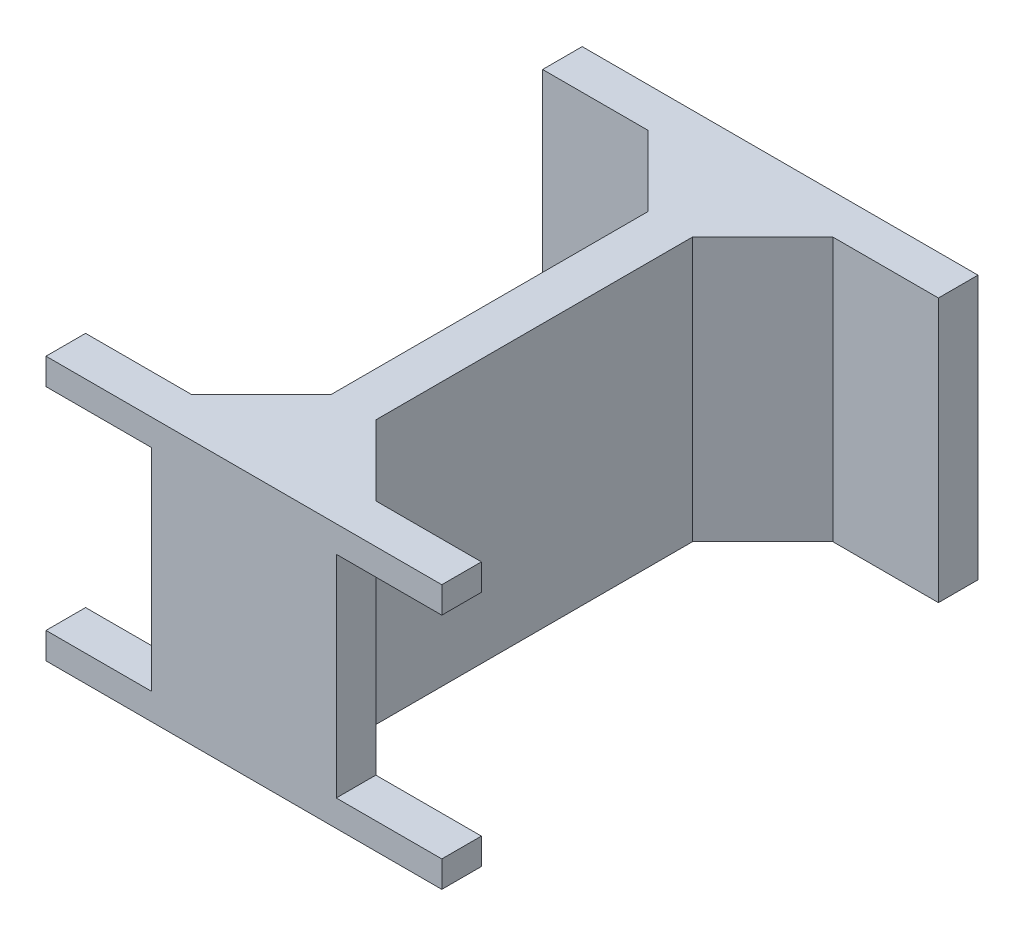
ISO-10303-21;
HEADER;
FILE_DESCRIPTION(('STEP AP214'),'2;1');
FILE_NAME('part.step','',(''),(''),'','','');
FILE_SCHEMA(('AUTOMOTIVE_DESIGN { 1 0 10303 214 1 1 1 1 }'));
ENDSEC;
DATA;
#1=APPLICATION_CONTEXT('core data for automotive mechanical design processes');
#2=APPLICATION_PROTOCOL_DEFINITION('international standard','automotive_design',2000,#1);
#3=PRODUCT_CONTEXT('',#1,'mechanical');
#4=PRODUCT('Part','Part','',(#3));
#5=PRODUCT_RELATED_PRODUCT_CATEGORY('part','',(#4));
#6=PRODUCT_DEFINITION_FORMATION('','',#4);
#7=PRODUCT_DEFINITION_CONTEXT('part definition',#1,'design');
#8=PRODUCT_DEFINITION('design','',#6,#7);
#9=PRODUCT_DEFINITION_SHAPE('','',#8);
#10=(LENGTH_UNIT() NAMED_UNIT(*) SI_UNIT(.MILLI.,.METRE.));
#11=(NAMED_UNIT(*) PLANE_ANGLE_UNIT() SI_UNIT($,.RADIAN.));
#12=(NAMED_UNIT(*) SI_UNIT($,.STERADIAN.) SOLID_ANGLE_UNIT());
#13=UNCERTAINTY_MEASURE_WITH_UNIT(LENGTH_MEASURE(1.E-05),#10,'distance_accuracy_value','');
#14=(GEOMETRIC_REPRESENTATION_CONTEXT(3) GLOBAL_UNCERTAINTY_ASSIGNED_CONTEXT((#13)) GLOBAL_UNIT_ASSIGNED_CONTEXT((#10,
#11,#12)) REPRESENTATION_CONTEXT('',''));
#15=CARTESIAN_POINT('',(0.,0.,0.));
#16=DIRECTION('',(0.,0.,1.));
#17=DIRECTION('',(1.,0.,0.));
#18=AXIS2_PLACEMENT_3D('',#15,#16,#17);
#19=CARTESIAN_POINT('',(-40.8076923076923,18.1864697802198,101.6));
#20=DIRECTION('',(1.,0.,0.));
#21=DIRECTION('',(0.,1.,0.));
#22=AXIS2_PLACEMENT_3D('',#19,#20,#21);
#23=PLANE('',#22);
#24=DIRECTION('',(0.,1.,0.));
#25=VECTOR('',#24,1.);
#26=CARTESIAN_POINT('',(-40.8076923076923,-83.4135302197802,94.1));
#27=LINE('',#26,#25);
#28=CARTESIAN_POINT('',(-40.8076923076923,13.1864697802198,94.1));
#29=VERTEX_POINT('',#28);
#30=CARTESIAN_POINT('',(-40.8076923076923,18.1864697802198,94.1));
#31=VERTEX_POINT('',#30);
#32=EDGE_CURVE('E284',#29,#31,#27,.T.);
#33=ORIENTED_EDGE('',*,*,#32,.F.);
#34=DIRECTION('',(0.,0.,1.));
#35=VECTOR('',#34,1.);
#36=CARTESIAN_POINT('',(-40.8076923076923,13.1864697802198,91.6));
#37=LINE('',#36,#35);
#38=CARTESIAN_POINT('',(-40.8076923076923,13.1864697802198,101.6));
#39=VERTEX_POINT('',#38);
#40=EDGE_CURVE('E630',#29,#39,#37,.T.);
#41=ORIENTED_EDGE('',*,*,#40,.T.);
#42=DIRECTION('',(0.,-1.,0.));
#43=VECTOR('',#42,1.);
#44=CARTESIAN_POINT('',(-40.8076923076923,18.1864697802198,101.6));
#45=LINE('',#44,#43);
#46=CARTESIAN_POINT('',(-40.8076923076923,18.1864697802198,101.6));
#47=VERTEX_POINT('',#46);
#48=EDGE_CURVE('E215',#47,#39,#45,.T.);
#49=ORIENTED_EDGE('',*,*,#48,.F.);
#50=DIRECTION('',(0.,0.,-1.));
#51=VECTOR('',#50,1.);
#52=CARTESIAN_POINT('',(-40.8076923076923,18.1864697802198,101.6));
#53=LINE('',#52,#51);
#54=EDGE_CURVE('E243',#47,#31,#53,.T.);
#55=ORIENTED_EDGE('',*,*,#54,.T.);
#56=EDGE_LOOP('',(#33,#41,#49,#55));
#57=FACE_BOUND('',#56,.T.);
#58=ADVANCED_FACE('F33',(#57),#23,.F.);
#59=CARTESIAN_POINT('',(-20.8076923076923,-83.4135302197802,94.1));
#60=DIRECTION('',(0.,0.,1.));
#61=DIRECTION('',(1.,0.,0.));
#62=AXIS2_PLACEMENT_3D('',#59,#60,#61);
#63=PLANE('',#62);
#64=DIRECTION('',(0.,1.,0.));
#65=VECTOR('',#64,1.);
#66=CARTESIAN_POINT('',(-20.8076923076923,-83.4135302197802,94.1));
#67=LINE('',#66,#65);
#68=CARTESIAN_POINT('',(-20.8076923076923,13.1864697802198,94.1));
#69=VERTEX_POINT('',#68);
#70=CARTESIAN_POINT('',(-20.8076923076923,18.1864697802198,94.1));
#71=VERTEX_POINT('',#70);
#72=EDGE_CURVE('E277',#69,#71,#67,.T.);
#73=ORIENTED_EDGE('',*,*,#72,.F.);
#74=DIRECTION('',(-1.,0.,0.));
#75=VECTOR('',#74,1.);
#76=CARTESIAN_POINT('',(-20.8076923076923,13.1864697802198,94.1));
#77=LINE('',#76,#75);
#78=EDGE_CURVE('E11',#69,#29,#77,.T.);
#79=ORIENTED_EDGE('',*,*,#78,.T.);
#80=ORIENTED_EDGE('',*,*,#32,.T.);
#81=DIRECTION('',(1.,0.,0.));
#82=VECTOR('',#81,1.);
#83=CARTESIAN_POINT('',(-20.8076923076923,18.1864697802198,94.1));
#84=LINE('',#83,#82);
#85=EDGE_CURVE('E346',#31,#71,#84,.T.);
#86=ORIENTED_EDGE('',*,*,#85,.T.);
#87=EDGE_LOOP('',(#73,#79,#80,#86));
#88=FACE_BOUND('',#87,.T.);
#89=ADVANCED_FACE('F382',(#88),#63,.F.);
#90=CARTESIAN_POINT('',(34.1923076923077,18.1864697802198,101.6));
#91=DIRECTION('',(-1.,0.,0.));
#92=DIRECTION('',(0.,-1.,0.));
#93=AXIS2_PLACEMENT_3D('',#90,#91,#92);
#94=PLANE('',#93);
#95=DIRECTION('',(0.,1.,0.));
#96=VECTOR('',#95,1.);
#97=CARTESIAN_POINT('',(34.1923076923077,-83.4135302197802,94.1));
#98=LINE('',#97,#96);
#99=CARTESIAN_POINT('',(34.1923076923077,-31.8135302197802,94.1));
#100=VERTEX_POINT('',#99);
#101=CARTESIAN_POINT('',(34.1923076923077,-26.8135302197802,94.1));
#102=VERTEX_POINT('',#101);
#103=EDGE_CURVE('E336',#100,#102,#98,.T.);
#104=ORIENTED_EDGE('',*,*,#103,.T.);
#105=DIRECTION('',(0.,0.,1.));
#106=VECTOR('',#105,1.);
#107=CARTESIAN_POINT('',(34.1923076923077,-26.8135302197802,91.6));
#108=LINE('',#107,#106);
#109=CARTESIAN_POINT('',(34.1923076923077,-26.8135302197802,101.6));
#110=VERTEX_POINT('',#109);
#111=EDGE_CURVE('E640',#102,#110,#108,.T.);
#112=ORIENTED_EDGE('',*,*,#111,.T.);
#113=DIRECTION('',(0.,1.,0.));
#114=VECTOR('',#113,1.);
#115=CARTESIAN_POINT('',(34.1923076923077,18.1864697802198,101.6));
#116=LINE('',#115,#114);
#117=CARTESIAN_POINT('',(34.1923076923077,-31.8135302197802,101.6));
#118=VERTEX_POINT('',#117);
#119=EDGE_CURVE('E229',#118,#110,#116,.T.);
#120=ORIENTED_EDGE('',*,*,#119,.F.);
#121=DIRECTION('',(0.,0.,-1.));
#122=VECTOR('',#121,1.);
#123=CARTESIAN_POINT('',(34.1923076923077,-31.8135302197802,101.6));
#124=LINE('',#123,#122);
#125=EDGE_CURVE('E251',#118,#100,#124,.T.);
#126=ORIENTED_EDGE('',*,*,#125,.T.);
#127=EDGE_LOOP('',(#104,#112,#120,#126));
#128=FACE_BOUND('',#127,.T.);
#129=ADVANCED_FACE('F387',(#128),#94,.F.);
#130=CARTESIAN_POINT('',(34.1923076923077,-83.4135302197802,94.1));
#131=DIRECTION('',(0.,0.,1.));
#132=DIRECTION('',(1.,0.,0.));
#133=AXIS2_PLACEMENT_3D('',#130,#131,#132);
#134=PLANE('',#133);
#135=DIRECTION('',(0.,1.,0.));
#136=VECTOR('',#135,1.);
#137=CARTESIAN_POINT('',(14.1923076923077,-83.4135302197802,94.1));
#138=LINE('',#137,#136);
#139=CARTESIAN_POINT('',(14.1923076923077,-31.8135302197802,94.1));
#140=VERTEX_POINT('',#139);
#141=CARTESIAN_POINT('',(14.1923076923077,-26.8135302197802,94.1));
#142=VERTEX_POINT('',#141);
#143=EDGE_CURVE('E660',#140,#142,#138,.T.);
#144=ORIENTED_EDGE('',*,*,#143,.T.);
#145=DIRECTION('',(1.,0.,0.));
#146=VECTOR('',#145,1.);
#147=CARTESIAN_POINT('',(34.1923076923077,-26.8135302197802,94.1));
#148=LINE('',#147,#146);
#149=EDGE_CURVE('E259',#142,#102,#148,.T.);
#150=ORIENTED_EDGE('',*,*,#149,.T.);
#151=ORIENTED_EDGE('',*,*,#103,.F.);
#152=DIRECTION('',(1.,0.,0.));
#153=VECTOR('',#152,1.);
#154=CARTESIAN_POINT('',(-40.8076923076923,-31.8135302197802,94.1000000000001));
#155=LINE('',#154,#153);
#156=EDGE_CURVE('E343',#140,#100,#155,.T.);
#157=ORIENTED_EDGE('',*,*,#156,.F.);
#158=EDGE_LOOP('',(#144,#150,#151,#157));
#159=FACE_BOUND('',#158,.T.);
#160=ADVANCED_FACE('F434',(#159),#134,.F.);
#161=CARTESIAN_POINT('',(34.1923076923077,13.1864697802198,101.6));
#162=VERTEX_POINT('',#161);
#163=CARTESIAN_POINT('',(34.1923076923077,18.1864697802198,101.6));
#164=VERTEX_POINT('',#163);
#165=EDGE_CURVE('E228',#162,#164,#116,.T.);
#166=ORIENTED_EDGE('',*,*,#165,.F.);
#167=DIRECTION('',(0.,0.,1.));
#168=VECTOR('',#167,1.);
#169=CARTESIAN_POINT('',(34.1923076923077,13.1864697802198,91.6));
#170=LINE('',#169,#168);
#171=CARTESIAN_POINT('',(34.1923076923077,13.1864697802198,94.1));
#172=VERTEX_POINT('',#171);
#173=EDGE_CURVE('E619',#172,#162,#170,.T.);
#174=ORIENTED_EDGE('',*,*,#173,.F.);
#175=CARTESIAN_POINT('',(34.1923076923077,18.1864697802198,94.1));
#176=VERTEX_POINT('',#175);
#177=EDGE_CURVE('E659',#172,#176,#98,.T.);
#178=ORIENTED_EDGE('',*,*,#177,.T.);
#179=DIRECTION('',(0.,0.,-1.));
#180=VECTOR('',#179,1.);
#181=CARTESIAN_POINT('',(34.1923076923077,18.1864697802198,101.6));
#182=LINE('',#181,#180);
#183=EDGE_CURVE('E247',#164,#176,#182,.T.);
#184=ORIENTED_EDGE('',*,*,#183,.F.);
#185=EDGE_LOOP('',(#166,#174,#178,#184));
#186=FACE_BOUND('',#185,.T.);
#187=ADVANCED_FACE('F392',(#186),#94,.F.);
#188=DIRECTION('',(0.,0.,-1.));
#189=VECTOR('',#188,1.);
#190=CARTESIAN_POINT('',(-40.8076923076923,-31.8135302197802,101.6));
#191=LINE('',#190,#189);
#192=CARTESIAN_POINT('',(-40.8076923076923,-31.8135302197802,7.50000000000001));
#193=VERTEX_POINT('',#192);
#194=CARTESIAN_POINT('',(-40.8076923076923,-31.8135302197802,0.));
#195=VERTEX_POINT('',#194);
#196=EDGE_CURVE('E254',#193,#195,#191,.T.);
#197=ORIENTED_EDGE('',*,*,#196,.F.);
#198=DIRECTION('',(0.,1.,0.));
#199=VECTOR('',#198,1.);
#200=CARTESIAN_POINT('',(-40.8076923076923,-83.4135302197802,7.50000000000001));
#201=LINE('',#200,#199);
#202=CARTESIAN_POINT('',(-40.8076923076923,18.1864697802198,7.50000000000001));
#203=VERTEX_POINT('',#202);
#204=EDGE_CURVE('E289',#193,#203,#201,.T.);
#205=ORIENTED_EDGE('',*,*,#204,.T.);
#206=CARTESIAN_POINT('',(-40.8076923076923,18.1864697802198,0.));
#207=VERTEX_POINT('',#206);
#208=EDGE_CURVE('E234',#203,#207,#53,.T.);
#209=ORIENTED_EDGE('',*,*,#208,.T.);
#210=DIRECTION('',(0.,-1.,0.));
#211=VECTOR('',#210,1.);
#212=CARTESIAN_POINT('',(-40.8076923076923,18.1864697802198,0.));
#213=LINE('',#212,#211);
#214=EDGE_CURVE('E235',#207,#195,#213,.T.);
#215=ORIENTED_EDGE('',*,*,#214,.T.);
#216=EDGE_LOOP('',(#197,#205,#209,#215));
#217=FACE_BOUND('',#216,.T.);
#218=ADVANCED_FACE('F305',(#217),#23,.F.);
#219=CARTESIAN_POINT('',(-40.8076923076923,-26.8135302197802,101.6));
#220=VERTEX_POINT('',#219);
#221=CARTESIAN_POINT('',(-40.8076923076923,-31.8135302197802,101.6));
#222=VERTEX_POINT('',#221);
#223=EDGE_CURVE('E207',#220,#222,#45,.T.);
#224=ORIENTED_EDGE('',*,*,#223,.F.);
#225=DIRECTION('',(0.,0.,1.));
#226=VECTOR('',#225,1.);
#227=CARTESIAN_POINT('',(-40.8076923076923,-26.8135302197802,91.6));
#228=LINE('',#227,#226);
#229=CARTESIAN_POINT('',(-40.8076923076923,-26.8135302197802,94.1));
#230=VERTEX_POINT('',#229);
#231=EDGE_CURVE('E192',#230,#220,#228,.T.);
#232=ORIENTED_EDGE('',*,*,#231,.F.);
#233=CARTESIAN_POINT('',(-40.8076923076923,-31.8135302197802,94.1));
#234=VERTEX_POINT('',#233);
#235=EDGE_CURVE('E267',#234,#230,#27,.T.);
#236=ORIENTED_EDGE('',*,*,#235,.F.);
#237=EDGE_CURVE('E214',#222,#234,#191,.T.);
#238=ORIENTED_EDGE('',*,*,#237,.F.);
#239=EDGE_LOOP('',(#224,#232,#236,#238));
#240=FACE_BOUND('',#239,.T.);
#241=ADVANCED_FACE('F35',(#240),#23,.F.);
#242=CARTESIAN_POINT('',(-40.8076923076923,-31.8135302197802,101.6));
#243=DIRECTION('',(0.,1.,0.));
#244=DIRECTION('',(0.,0.,1.));
#245=AXIS2_PLACEMENT_3D('',#242,#243,#244);
#246=PLANE('',#245);
#247=DIRECTION('',(0.707106781186547,0.,0.707106781186549));
#248=VECTOR('',#247,1.);
#249=CARTESIAN_POINT('',(-9.55769230769222,-31.8135302197802,70.35));
#250=LINE('',#249,#248);
#251=CARTESIAN_POINT('',(0.892307692307742,-31.8135302197802,80.8));
#252=VERTEX_POINT('',#251);
#253=EDGE_CURVE('E341',#252,#140,#250,.T.);
#254=ORIENTED_EDGE('',*,*,#253,.T.);
#255=ORIENTED_EDGE('',*,*,#156,.T.);
#256=ORIENTED_EDGE('',*,*,#125,.F.);
#257=DIRECTION('',(1.,0.,0.));
#258=VECTOR('',#257,1.);
#259=CARTESIAN_POINT('',(-40.8076923076923,-31.8135302197802,101.6));
#260=LINE('',#259,#258);
#261=EDGE_CURVE('E219',#222,#118,#260,.T.);
#262=ORIENTED_EDGE('',*,*,#261,.F.);
#263=ORIENTED_EDGE('',*,*,#237,.T.);
#264=DIRECTION('',(1.,0.,0.));
#265=VECTOR('',#264,1.);
#266=CARTESIAN_POINT('',(-40.8076923076923,-31.8135302197802,94.1));
#267=LINE('',#266,#265);
#268=CARTESIAN_POINT('',(-20.8076923076923,-31.8135302197802,94.1));
#269=VERTEX_POINT('',#268);
#270=EDGE_CURVE('E287',#234,#269,#267,.T.);
#271=ORIENTED_EDGE('',*,*,#270,.T.);
#272=DIRECTION('',(0.707106781186545,0.,-0.70710678118655));
#273=VECTOR('',#272,1.);
#274=CARTESIAN_POINT('',(-34.5576923076922,-31.8135302197802,107.85));
#275=LINE('',#274,#273);
#276=CARTESIAN_POINT('',(-7.50769230769244,-31.8135302197802,80.8));
#277=VERTEX_POINT('',#276);
#278=EDGE_CURVE('E274',#269,#277,#275,.T.);
#279=ORIENTED_EDGE('',*,*,#278,.T.);
#280=DIRECTION('',(0.,0.,-1.));
#281=VECTOR('',#280,1.);
#282=CARTESIAN_POINT('',(-7.50769230769244,-31.8135302197802,101.6));
#283=LINE('',#282,#281);
#284=CARTESIAN_POINT('',(-7.50769230769245,-31.8135302197802,20.8));
#285=VERTEX_POINT('',#284);
#286=EDGE_CURVE('E291',#277,#285,#283,.T.);
#287=ORIENTED_EDGE('',*,*,#286,.T.);
#288=DIRECTION('',(-0.707106781186542,0.,-0.707106781186553));
#289=VECTOR('',#288,1.);
#290=CARTESIAN_POINT('',(16.2423076923078,-31.8135302197802,44.5500000000007));
#291=LINE('',#290,#289);
#292=CARTESIAN_POINT('',(-20.8076923076923,-31.8135302197802,7.5));
#293=VERTEX_POINT('',#292);
#294=EDGE_CURVE('E293',#285,#293,#291,.T.);
#295=ORIENTED_EDGE('',*,*,#294,.T.);
#296=DIRECTION('',(-1.,0.,0.));
#297=VECTOR('',#296,1.);
#298=CARTESIAN_POINT('',(-40.8076923076923,-31.8135302197802,7.50000000000001));
#299=LINE('',#298,#297);
#300=EDGE_CURVE('E225',#293,#193,#299,.T.);
#301=ORIENTED_EDGE('',*,*,#300,.T.);
#302=ORIENTED_EDGE('',*,*,#196,.T.);
#303=DIRECTION('',(1.,0.,0.));
#304=VECTOR('',#303,1.);
#305=CARTESIAN_POINT('',(-40.8076923076923,-31.8135302197802,0.));
#306=LINE('',#305,#304);
#307=CARTESIAN_POINT('',(34.1923076923077,-31.8135302197802,0.));
#308=VERTEX_POINT('',#307);
#309=EDGE_CURVE('E238',#195,#308,#306,.T.);
#310=ORIENTED_EDGE('',*,*,#309,.T.);
#311=CARTESIAN_POINT('',(34.1923076923077,-31.8135302197802,7.50000000000001));
#312=VERTEX_POINT('',#311);
#313=EDGE_CURVE('E250',#312,#308,#124,.T.);
#314=ORIENTED_EDGE('',*,*,#313,.F.);
#315=DIRECTION('',(-1.,0.,0.));
#316=VECTOR('',#315,1.);
#317=CARTESIAN_POINT('',(-40.8076923076923,-31.8135302197802,7.49999999999999));
#318=LINE('',#317,#316);
#319=CARTESIAN_POINT('',(14.1923076923077,-31.8135302197802,7.5));
#320=VERTEX_POINT('',#319);
#321=EDGE_CURVE('E315',#312,#320,#318,.T.);
#322=ORIENTED_EDGE('',*,*,#321,.T.);
#323=DIRECTION('',(-0.707106781186546,0.,0.707106781186549));
#324=VECTOR('',#323,1.);
#325=CARTESIAN_POINT('',(-60.3576923076922,-31.8135302197802,82.0500000000002));
#326=LINE('',#325,#324);
#327=CARTESIAN_POINT('',(0.892307692307742,-31.8135302197802,20.8));
#328=VERTEX_POINT('',#327);
#329=EDGE_CURVE('E335',#320,#328,#326,.T.);
#330=ORIENTED_EDGE('',*,*,#329,.T.);
#331=DIRECTION('',(0.,0.,1.));
#332=VECTOR('',#331,1.);
#333=CARTESIAN_POINT('',(0.892307692307741,-31.8135302197802,101.6));
#334=LINE('',#333,#332);
#335=EDGE_CURVE('E338',#328,#252,#334,.T.);
#336=ORIENTED_EDGE('',*,*,#335,.T.);
#337=EDGE_LOOP('',(#254,#255,#256,#262,#263,#271,#279,#287,#295,#301,#302,#310,#314,#322,#330,#336));
#338=FACE_BOUND('',#337,.T.);
#339=ADVANCED_FACE('F299',(#338),#246,.F.);
#340=CARTESIAN_POINT('',(34.1923076923077,18.1864697802198,7.50000000000001));
#341=VERTEX_POINT('',#340);
#342=CARTESIAN_POINT('',(34.1923076923077,18.1864697802198,0.));
#343=VERTEX_POINT('',#342);
#344=EDGE_CURVE('E246',#341,#343,#182,.T.);
#345=ORIENTED_EDGE('',*,*,#344,.F.);
#346=DIRECTION('',(0.,1.,0.));
#347=VECTOR('',#346,1.);
#348=CARTESIAN_POINT('',(34.1923076923077,-83.4135302197802,7.50000000000001));
#349=LINE('',#348,#347);
#350=EDGE_CURVE('E320',#312,#341,#349,.T.);
#351=ORIENTED_EDGE('',*,*,#350,.F.);
#352=ORIENTED_EDGE('',*,*,#313,.T.);
#353=DIRECTION('',(0.,1.,0.));
#354=VECTOR('',#353,1.);
#355=CARTESIAN_POINT('',(34.1923076923077,18.1864697802198,0.));
#356=LINE('',#355,#354);
#357=EDGE_CURVE('E221',#308,#343,#356,.T.);
#358=ORIENTED_EDGE('',*,*,#357,.T.);
#359=EDGE_LOOP('',(#345,#351,#352,#358));
#360=FACE_BOUND('',#359,.T.);
#361=ADVANCED_FACE('F319',(#360),#94,.F.);
#362=CARTESIAN_POINT('',(-40.8076923076923,18.1864697802198,101.6));
#363=DIRECTION('',(0.,-1.,0.));
#364=DIRECTION('',(0.,0.,-1.));
#365=AXIS2_PLACEMENT_3D('',#362,#363,#364);
#366=PLANE('',#365);
#367=ORIENTED_EDGE('',*,*,#183,.T.);
#368=DIRECTION('',(1.,0.,0.));
#369=VECTOR('',#368,1.);
#370=CARTESIAN_POINT('',(34.1923076923077,18.1864697802198,94.1));
#371=LINE('',#370,#369);
#372=CARTESIAN_POINT('',(14.1923076923077,18.1864697802198,94.1));
#373=VERTEX_POINT('',#372);
#374=EDGE_CURVE('E325',#373,#176,#371,.T.);
#375=ORIENTED_EDGE('',*,*,#374,.F.);
#376=DIRECTION('',(0.707106781186546,0.,0.707106781186549));
#377=VECTOR('',#376,1.);
#378=CARTESIAN_POINT('',(14.1923076923077,18.1864697802198,94.1));
#379=LINE('',#378,#377);
#380=CARTESIAN_POINT('',(0.892307692307742,18.1864697802198,80.8));
#381=VERTEX_POINT('',#380);
#382=EDGE_CURVE('E330',#381,#373,#379,.T.);
#383=ORIENTED_EDGE('',*,*,#382,.F.);
#384=DIRECTION('',(0.,0.,1.));
#385=VECTOR('',#384,1.);
#386=CARTESIAN_POINT('',(0.892307692307742,18.1864697802198,80.8));
#387=LINE('',#386,#385);
#388=CARTESIAN_POINT('',(0.892307692307742,18.1864697802198,20.8));
#389=VERTEX_POINT('',#388);
#390=EDGE_CURVE('E652',#389,#381,#387,.T.);
#391=ORIENTED_EDGE('',*,*,#390,.F.);
#392=DIRECTION('',(-0.707106781186546,0.,0.707106781186549));
#393=VECTOR('',#392,1.);
#394=CARTESIAN_POINT('',(0.892307692307742,18.1864697802198,20.8));
#395=LINE('',#394,#393);
#396=CARTESIAN_POINT('',(14.1923076923077,18.1864697802198,7.5));
#397=VERTEX_POINT('',#396);
#398=EDGE_CURVE('E649',#397,#389,#395,.T.);
#399=ORIENTED_EDGE('',*,*,#398,.F.);
#400=DIRECTION('',(-1.,0.,0.));
#401=VECTOR('',#400,1.);
#402=CARTESIAN_POINT('',(14.1923076923077,18.1864697802198,7.5));
#403=LINE('',#402,#401);
#404=EDGE_CURVE('E643',#341,#397,#403,.T.);
#405=ORIENTED_EDGE('',*,*,#404,.F.);
#406=ORIENTED_EDGE('',*,*,#344,.T.);
#407=DIRECTION('',(-1.,0.,0.));
#408=VECTOR('',#407,1.);
#409=CARTESIAN_POINT('',(-40.8076923076923,18.1864697802198,0.));
#410=LINE('',#409,#408);
#411=EDGE_CURVE('E216',#343,#207,#410,.T.);
#412=ORIENTED_EDGE('',*,*,#411,.T.);
#413=ORIENTED_EDGE('',*,*,#208,.F.);
#414=DIRECTION('',(-1.,0.,0.));
#415=VECTOR('',#414,1.);
#416=CARTESIAN_POINT('',(-40.8076923076923,18.1864697802198,7.50000000000001));
#417=LINE('',#416,#415);
#418=CARTESIAN_POINT('',(-20.8076923076923,18.1864697802198,7.5));
#419=VERTEX_POINT('',#418);
#420=EDGE_CURVE('E285',#419,#203,#417,.T.);
#421=ORIENTED_EDGE('',*,*,#420,.F.);
#422=DIRECTION('',(-0.707106781186542,0.,-0.707106781186553));
#423=VECTOR('',#422,1.);
#424=CARTESIAN_POINT('',(-20.8076923076923,18.1864697802198,7.5));
#425=LINE('',#424,#423);
#426=CARTESIAN_POINT('',(-7.50769230769245,18.1864697802198,20.8));
#427=VERTEX_POINT('',#426);
#428=EDGE_CURVE('E353',#427,#419,#425,.T.);
#429=ORIENTED_EDGE('',*,*,#428,.F.);
#430=DIRECTION('',(0.,0.,-1.));
#431=VECTOR('',#430,1.);
#432=CARTESIAN_POINT('',(-7.50769230769245,18.1864697802198,20.8));
#433=LINE('',#432,#431);
#434=CARTESIAN_POINT('',(-7.50769230769244,18.1864697802198,80.8));
#435=VERTEX_POINT('',#434);
#436=EDGE_CURVE('E350',#435,#427,#433,.T.);
#437=ORIENTED_EDGE('',*,*,#436,.F.);
#438=DIRECTION('',(0.707106781186545,0.,-0.70710678118655));
#439=VECTOR('',#438,1.);
#440=CARTESIAN_POINT('',(-7.50769230769244,18.1864697802198,80.8));
#441=LINE('',#440,#439);
#442=EDGE_CURVE('E348',#71,#435,#441,.T.);
#443=ORIENTED_EDGE('',*,*,#442,.F.);
#444=ORIENTED_EDGE('',*,*,#85,.F.);
#445=ORIENTED_EDGE('',*,*,#54,.F.);
#446=DIRECTION('',(-1.,0.,0.));
#447=VECTOR('',#446,1.);
#448=CARTESIAN_POINT('',(-40.8076923076923,18.1864697802198,101.6));
#449=LINE('',#448,#447);
#450=EDGE_CURVE('E232',#164,#47,#449,.T.);
#451=ORIENTED_EDGE('',*,*,#450,.F.);
#452=EDGE_LOOP('',(#367,#375,#383,#391,#399,#405,#406,#412,#413,#421,#429,#437,#443,#444,#445,#451));
#453=FACE_BOUND('',#452,.T.);
#454=ADVANCED_FACE('F370',(#453),#366,.F.);
#455=CARTESIAN_POINT('',(0.,0.,101.6));
#456=DIRECTION('',(0.,0.,1.));
#457=DIRECTION('',(1.,0.,0.));
#458=AXIS2_PLACEMENT_3D('',#455,#456,#457);
#459=PLANE('',#458);
#460=DIRECTION('',(-1.,0.,0.));
#461=VECTOR('',#460,1.);
#462=CARTESIAN_POINT('',(-40.8076923076923,13.1864697802198,101.6));
#463=LINE('',#462,#461);
#464=CARTESIAN_POINT('',(-20.8076923076923,13.1864697802198,101.6));
#465=VERTEX_POINT('',#464);
#466=EDGE_CURVE('E202',#465,#39,#463,.T.);
#467=ORIENTED_EDGE('',*,*,#466,.F.);
#468=DIRECTION('',(0.,1.,0.));
#469=VECTOR('',#468,1.);
#470=CARTESIAN_POINT('',(-20.8076923076923,13.1864697802198,101.6));
#471=LINE('',#470,#469);
#472=CARTESIAN_POINT('',(-20.8076923076923,-26.8135302197802,101.6));
#473=VERTEX_POINT('',#472);
#474=EDGE_CURVE('E210',#473,#465,#471,.T.);
#475=ORIENTED_EDGE('',*,*,#474,.F.);
#476=DIRECTION('',(1.,0.,0.));
#477=VECTOR('',#476,1.);
#478=CARTESIAN_POINT('',(-40.8076923076923,-26.8135302197802,101.6));
#479=LINE('',#478,#477);
#480=EDGE_CURVE('E195',#220,#473,#479,.T.);
#481=ORIENTED_EDGE('',*,*,#480,.F.);
#482=ORIENTED_EDGE('',*,*,#223,.T.);
#483=ORIENTED_EDGE('',*,*,#261,.T.);
#484=ORIENTED_EDGE('',*,*,#119,.T.);
#485=DIRECTION('',(1.,0.,0.));
#486=VECTOR('',#485,1.);
#487=CARTESIAN_POINT('',(34.1923076923077,-26.8135302197802,101.6));
#488=LINE('',#487,#486);
#489=CARTESIAN_POINT('',(14.1923076923077,-26.8135302197802,101.6));
#490=VERTEX_POINT('',#489);
#491=EDGE_CURVE('E632',#490,#110,#488,.T.);
#492=ORIENTED_EDGE('',*,*,#491,.F.);
#493=DIRECTION('',(0.,-1.,0.));
#494=VECTOR('',#493,1.);
#495=CARTESIAN_POINT('',(14.1923076923077,-26.8135302197802,101.6));
#496=LINE('',#495,#494);
#497=CARTESIAN_POINT('',(14.1923076923077,13.1864697802198,101.6));
#498=VERTEX_POINT('',#497);
#499=EDGE_CURVE('E628',#498,#490,#496,.T.);
#500=ORIENTED_EDGE('',*,*,#499,.F.);
#501=DIRECTION('',(-1.,0.,0.));
#502=VECTOR('',#501,1.);
#503=CARTESIAN_POINT('',(34.1923076923077,13.1864697802198,101.6));
#504=LINE('',#503,#502);
#505=EDGE_CURVE('E626',#162,#498,#504,.T.);
#506=ORIENTED_EDGE('',*,*,#505,.F.);
#507=ORIENTED_EDGE('',*,*,#165,.T.);
#508=ORIENTED_EDGE('',*,*,#450,.T.);
#509=ORIENTED_EDGE('',*,*,#48,.T.);
#510=EDGE_LOOP('',(#467,#475,#481,#482,#483,#484,#492,#500,#506,#507,#508,#509));
#511=FACE_BOUND('',#510,.T.);
#512=ADVANCED_FACE('F206',(#511),#459,.T.);
#513=CARTESIAN_POINT('',(0.,0.,0.));
#514=DIRECTION('',(0.,0.,1.));
#515=DIRECTION('',(1.,0.,0.));
#516=AXIS2_PLACEMENT_3D('',#513,#514,#515);
#517=PLANE('',#516);
#518=ORIENTED_EDGE('',*,*,#214,.F.);
#519=ORIENTED_EDGE('',*,*,#411,.F.);
#520=ORIENTED_EDGE('',*,*,#357,.F.);
#521=ORIENTED_EDGE('',*,*,#309,.F.);
#522=EDGE_LOOP('',(#518,#519,#520,#521));
#523=FACE_BOUND('',#522,.T.);
#524=ADVANCED_FACE('F310',(#523),#517,.F.);
#525=CARTESIAN_POINT('',(-40.8076923076923,-83.4135302197802,7.50000000000001));
#526=DIRECTION('',(0.,0.,-1.));
#527=DIRECTION('',(-1.,0.,0.));
#528=AXIS2_PLACEMENT_3D('',#525,#526,#527);
#529=PLANE('',#528);
#530=DIRECTION('',(0.,1.,0.));
#531=VECTOR('',#530,1.);
#532=CARTESIAN_POINT('',(-20.8076923076923,-83.4135302197802,7.5));
#533=LINE('',#532,#531);
#534=EDGE_CURVE('E358',#293,#419,#533,.T.);
#535=ORIENTED_EDGE('',*,*,#534,.T.);
#536=ORIENTED_EDGE('',*,*,#420,.T.);
#537=ORIENTED_EDGE('',*,*,#204,.F.);
#538=ORIENTED_EDGE('',*,*,#300,.F.);
#539=EDGE_LOOP('',(#535,#536,#537,#538));
#540=FACE_BOUND('',#539,.T.);
#541=ADVANCED_FACE('F371',(#540),#529,.F.);
#542=CARTESIAN_POINT('',(-20.8076923076923,-83.4135302197802,7.5));
#543=DIRECTION('',(0.707106781186553,0.,-0.707106781186542));
#544=DIRECTION('',(-0.707106781186542,0.,-0.707106781186553));
#545=AXIS2_PLACEMENT_3D('',#542,#543,#544);
#546=PLANE('',#545);
#547=DIRECTION('',(0.,1.,0.));
#548=VECTOR('',#547,1.);
#549=CARTESIAN_POINT('',(-7.50769230769245,-83.4135302197802,20.8));
#550=LINE('',#549,#548);
#551=EDGE_CURVE('E278',#285,#427,#550,.T.);
#552=ORIENTED_EDGE('',*,*,#551,.T.);
#553=ORIENTED_EDGE('',*,*,#428,.T.);
#554=ORIENTED_EDGE('',*,*,#534,.F.);
#555=ORIENTED_EDGE('',*,*,#294,.F.);
#556=EDGE_LOOP('',(#552,#553,#554,#555));
#557=FACE_BOUND('',#556,.T.);
#558=ADVANCED_FACE('F362',(#557),#546,.F.);
#559=CARTESIAN_POINT('',(-7.50769230769245,-83.4135302197802,20.8));
#560=DIRECTION('',(1.,0.,0.));
#561=DIRECTION('',(0.,0.,-1.));
#562=AXIS2_PLACEMENT_3D('',#559,#560,#561);
#563=PLANE('',#562);
#564=DIRECTION('',(0.,1.,0.));
#565=VECTOR('',#564,1.);
#566=CARTESIAN_POINT('',(-7.50769230769244,-83.4135302197802,80.8));
#567=LINE('',#566,#565);
#568=EDGE_CURVE('E275',#277,#435,#567,.T.);
#569=ORIENTED_EDGE('',*,*,#568,.T.);
#570=ORIENTED_EDGE('',*,*,#436,.T.);
#571=ORIENTED_EDGE('',*,*,#551,.F.);
#572=ORIENTED_EDGE('',*,*,#286,.F.);
#573=EDGE_LOOP('',(#569,#570,#571,#572));
#574=FACE_BOUND('',#573,.T.);
#575=ADVANCED_FACE('F367',(#574),#563,.F.);
#576=CARTESIAN_POINT('',(-7.50769230769244,-83.4135302197802,80.8));
#577=DIRECTION('',(0.70710678118655,0.,0.707106781186545));
#578=DIRECTION('',(0.707106781186545,0.,-0.70710678118655));
#579=AXIS2_PLACEMENT_3D('',#576,#577,#578);
#580=PLANE('',#579);
#581=CARTESIAN_POINT('',(-20.8076923076923,-26.8135302197802,94.1));
#582=VERTEX_POINT('',#581);
#583=EDGE_CURVE('E265',#269,#582,#67,.T.);
#584=ORIENTED_EDGE('',*,*,#583,.T.);
#585=EDGE_CURVE('E271',#582,#69,#67,.T.);
#586=ORIENTED_EDGE('',*,*,#585,.T.);
#587=ORIENTED_EDGE('',*,*,#72,.T.);
#588=ORIENTED_EDGE('',*,*,#442,.T.);
#589=ORIENTED_EDGE('',*,*,#568,.F.);
#590=ORIENTED_EDGE('',*,*,#278,.F.);
#591=EDGE_LOOP('',(#584,#586,#587,#588,#589,#590));
#592=FACE_BOUND('',#591,.T.);
#593=ADVANCED_FACE('F270',(#592),#580,.F.);
#594=ORIENTED_EDGE('',*,*,#235,.T.);
#595=DIRECTION('',(1.,0.,0.));
#596=VECTOR('',#595,1.);
#597=CARTESIAN_POINT('',(-20.8076923076923,-26.8135302197802,94.1));
#598=LINE('',#597,#596);
#599=EDGE_CURVE('E41',#230,#582,#598,.T.);
#600=ORIENTED_EDGE('',*,*,#599,.T.);
#601=ORIENTED_EDGE('',*,*,#583,.F.);
#602=ORIENTED_EDGE('',*,*,#270,.F.);
#603=EDGE_LOOP('',(#594,#600,#601,#602));
#604=FACE_BOUND('',#603,.T.);
#605=ADVANCED_FACE('F264',(#604),#63,.F.);
#606=ORIENTED_EDGE('',*,*,#177,.F.);
#607=DIRECTION('',(-1.,0.,0.));
#608=VECTOR('',#607,1.);
#609=CARTESIAN_POINT('',(34.1923076923077,13.1864697802198,94.1));
#610=LINE('',#609,#608);
#611=CARTESIAN_POINT('',(14.1923076923077,13.1864697802198,94.1));
#612=VERTEX_POINT('',#611);
#613=EDGE_CURVE('E256',#172,#612,#610,.T.);
#614=ORIENTED_EDGE('',*,*,#613,.T.);
#615=EDGE_CURVE('E664',#612,#373,#138,.T.);
#616=ORIENTED_EDGE('',*,*,#615,.T.);
#617=ORIENTED_EDGE('',*,*,#374,.T.);
#618=EDGE_LOOP('',(#606,#614,#616,#617));
#619=FACE_BOUND('',#618,.T.);
#620=ADVANCED_FACE('F407',(#619),#134,.F.);
#621=CARTESIAN_POINT('',(14.1923076923077,-83.4135302197802,94.1));
#622=DIRECTION('',(-0.707106781186548,0.,0.707106781186546));
#623=DIRECTION('',(0.707106781186547,0.,0.707106781186549));
#624=AXIS2_PLACEMENT_3D('',#621,#622,#623);
#625=PLANE('',#624);
#626=DIRECTION('',(0.,1.,0.));
#627=VECTOR('',#626,1.);
#628=CARTESIAN_POINT('',(0.892307692307742,-83.4135302197802,80.8));
#629=LINE('',#628,#627);
#630=EDGE_CURVE('E665',#252,#381,#629,.T.);
#631=ORIENTED_EDGE('',*,*,#630,.T.);
#632=ORIENTED_EDGE('',*,*,#382,.T.);
#633=ORIENTED_EDGE('',*,*,#615,.F.);
#634=EDGE_CURVE('E663',#142,#612,#138,.T.);
#635=ORIENTED_EDGE('',*,*,#634,.F.);
#636=ORIENTED_EDGE('',*,*,#143,.F.);
#637=ORIENTED_EDGE('',*,*,#253,.F.);
#638=EDGE_LOOP('',(#631,#632,#633,#635,#636,#637));
#639=FACE_BOUND('',#638,.T.);
#640=ADVANCED_FACE('F431',(#639),#625,.F.);
#641=CARTESIAN_POINT('',(0.892307692307742,-83.4135302197802,80.8));
#642=DIRECTION('',(-1.,0.,0.));
#643=DIRECTION('',(0.,0.,1.));
#644=AXIS2_PLACEMENT_3D('',#641,#642,#643);
#645=PLANE('',#644);
#646=DIRECTION('',(0.,1.,0.));
#647=VECTOR('',#646,1.);
#648=CARTESIAN_POINT('',(0.892307692307742,-83.4135302197802,20.8));
#649=LINE('',#648,#647);
#650=EDGE_CURVE('E327',#328,#389,#649,.T.);
#651=ORIENTED_EDGE('',*,*,#650,.T.);
#652=ORIENTED_EDGE('',*,*,#390,.T.);
#653=ORIENTED_EDGE('',*,*,#630,.F.);
#654=ORIENTED_EDGE('',*,*,#335,.F.);
#655=EDGE_LOOP('',(#651,#652,#653,#654));
#656=FACE_BOUND('',#655,.T.);
#657=ADVANCED_FACE('F441',(#656),#645,.F.);
#658=CARTESIAN_POINT('',(0.892307692307742,-83.4135302197802,20.8));
#659=DIRECTION('',(-0.707106781186549,0.,-0.707106781186546));
#660=DIRECTION('',(-0.707106781186546,0.,0.707106781186549));
#661=AXIS2_PLACEMENT_3D('',#658,#659,#660);
#662=PLANE('',#661);
#663=DIRECTION('',(0.,1.,0.));
#664=VECTOR('',#663,1.);
#665=CARTESIAN_POINT('',(14.1923076923077,-83.4135302197802,7.5));
#666=LINE('',#665,#664);
#667=EDGE_CURVE('E324',#320,#397,#666,.T.);
#668=ORIENTED_EDGE('',*,*,#667,.T.);
#669=ORIENTED_EDGE('',*,*,#398,.T.);
#670=ORIENTED_EDGE('',*,*,#650,.F.);
#671=ORIENTED_EDGE('',*,*,#329,.F.);
#672=EDGE_LOOP('',(#668,#669,#670,#671));
#673=FACE_BOUND('',#672,.T.);
#674=ADVANCED_FACE('F450',(#673),#662,.F.);
#675=CARTESIAN_POINT('',(14.1923076923077,-83.4135302197802,7.5));
#676=DIRECTION('',(0.,0.,-1.));
#677=DIRECTION('',(-1.,0.,0.));
#678=AXIS2_PLACEMENT_3D('',#675,#676,#677);
#679=PLANE('',#678);
#680=ORIENTED_EDGE('',*,*,#350,.T.);
#681=ORIENTED_EDGE('',*,*,#404,.T.);
#682=ORIENTED_EDGE('',*,*,#667,.F.);
#683=ORIENTED_EDGE('',*,*,#321,.F.);
#684=EDGE_LOOP('',(#680,#681,#682,#683));
#685=FACE_BOUND('',#684,.T.);
#686=ADVANCED_FACE('F459',(#685),#679,.F.);
#687=CARTESIAN_POINT('',(34.1923076923077,-26.8135302197802,91.6));
#688=DIRECTION('',(0.,-1.,0.));
#689=DIRECTION('',(1.,0.,0.));
#690=AXIS2_PLACEMENT_3D('',#687,#688,#689);
#691=PLANE('',#690);
#692=DIRECTION('',(0.,0.,1.));
#693=VECTOR('',#692,1.);
#694=CARTESIAN_POINT('',(14.1923076923077,-26.8135302197802,91.6));
#695=LINE('',#694,#693);
#696=EDGE_CURVE('E56',#142,#490,#695,.T.);
#697=ORIENTED_EDGE('',*,*,#696,.T.);
#698=ORIENTED_EDGE('',*,*,#491,.T.);
#699=ORIENTED_EDGE('',*,*,#111,.F.);
#700=ORIENTED_EDGE('',*,*,#149,.F.);
#701=EDGE_LOOP('',(#697,#698,#699,#700));
#702=FACE_BOUND('',#701,.T.);
#703=ADVANCED_FACE('F467',(#702),#691,.F.);
#704=CARTESIAN_POINT('',(34.1923076923077,13.1864697802198,91.6));
#705=DIRECTION('',(0.,1.,0.));
#706=DIRECTION('',(-1.,0.,0.));
#707=AXIS2_PLACEMENT_3D('',#704,#705,#706);
#708=PLANE('',#707);
#709=ORIENTED_EDGE('',*,*,#173,.T.);
#710=ORIENTED_EDGE('',*,*,#505,.T.);
#711=DIRECTION('',(0.,0.,1.));
#712=VECTOR('',#711,1.);
#713=CARTESIAN_POINT('',(14.1923076923077,13.1864697802198,91.6));
#714=LINE('',#713,#712);
#715=EDGE_CURVE('E645',#612,#498,#714,.T.);
#716=ORIENTED_EDGE('',*,*,#715,.F.);
#717=ORIENTED_EDGE('',*,*,#613,.F.);
#718=EDGE_LOOP('',(#709,#710,#716,#717));
#719=FACE_BOUND('',#718,.T.);
#720=ADVANCED_FACE('F473',(#719),#708,.F.);
#721=CARTESIAN_POINT('',(14.1923076923077,-26.8135302197802,91.6));
#722=DIRECTION('',(-1.,0.,0.));
#723=DIRECTION('',(0.,0.,1.));
#724=AXIS2_PLACEMENT_3D('',#721,#722,#723);
#725=PLANE('',#724);
#726=ORIENTED_EDGE('',*,*,#715,.T.);
#727=ORIENTED_EDGE('',*,*,#499,.T.);
#728=ORIENTED_EDGE('',*,*,#696,.F.);
#729=ORIENTED_EDGE('',*,*,#634,.T.);
#730=EDGE_LOOP('',(#726,#727,#728,#729));
#731=FACE_BOUND('',#730,.T.);
#732=ADVANCED_FACE('F481',(#731),#725,.F.);
#733=CARTESIAN_POINT('',(-40.8076923076923,13.1864697802198,91.6));
#734=DIRECTION('',(0.,1.,0.));
#735=DIRECTION('',(0.,0.,1.));
#736=AXIS2_PLACEMENT_3D('',#733,#734,#735);
#737=PLANE('',#736);
#738=DIRECTION('',(0.,0.,1.));
#739=VECTOR('',#738,1.);
#740=CARTESIAN_POINT('',(-20.8076923076923,13.1864697802198,91.6));
#741=LINE('',#740,#739);
#742=EDGE_CURVE('E635',#69,#465,#741,.T.);
#743=ORIENTED_EDGE('',*,*,#742,.T.);
#744=ORIENTED_EDGE('',*,*,#466,.T.);
#745=ORIENTED_EDGE('',*,*,#40,.F.);
#746=ORIENTED_EDGE('',*,*,#78,.F.);
#747=EDGE_LOOP('',(#743,#744,#745,#746));
#748=FACE_BOUND('',#747,.T.);
#749=ADVANCED_FACE('F489',(#748),#737,.F.);
#750=CARTESIAN_POINT('',(-20.8076923076923,13.1864697802198,91.6));
#751=DIRECTION('',(1.,0.,0.));
#752=DIRECTION('',(0.,1.,0.));
#753=AXIS2_PLACEMENT_3D('',#750,#751,#752);
#754=PLANE('',#753);
#755=DIRECTION('',(0.,0.,1.));
#756=VECTOR('',#755,1.);
#757=CARTESIAN_POINT('',(-20.8076923076923,-26.8135302197802,91.6));
#758=LINE('',#757,#756);
#759=EDGE_CURVE('E48',#582,#473,#758,.T.);
#760=ORIENTED_EDGE('',*,*,#759,.T.);
#761=ORIENTED_EDGE('',*,*,#474,.T.);
#762=ORIENTED_EDGE('',*,*,#742,.F.);
#763=ORIENTED_EDGE('',*,*,#585,.F.);
#764=EDGE_LOOP('',(#760,#761,#762,#763));
#765=FACE_BOUND('',#764,.T.);
#766=ADVANCED_FACE('F495',(#765),#754,.F.);
#767=CARTESIAN_POINT('',(-40.8076923076923,-26.8135302197802,91.6));
#768=DIRECTION('',(0.,-1.,0.));
#769=DIRECTION('',(0.,0.,-1.));
#770=AXIS2_PLACEMENT_3D('',#767,#768,#769);
#771=PLANE('',#770);
#772=ORIENTED_EDGE('',*,*,#231,.T.);
#773=ORIENTED_EDGE('',*,*,#480,.T.);
#774=ORIENTED_EDGE('',*,*,#759,.F.);
#775=ORIENTED_EDGE('',*,*,#599,.F.);
#776=EDGE_LOOP('',(#772,#773,#774,#775));
#777=FACE_BOUND('',#776,.T.);
#778=ADVANCED_FACE('F194',(#777),#771,.F.);
#779=CLOSED_SHELL('',(#58,#89,#129,#160,#187,#218,#241,#339,#361,#454,#512,#524,#541,#558,#575,
#593,#605,#620,#640,#657,#674,#686,#703,#720,#732,#749,#766,#778));
#780=MANIFOLD_SOLID_BREP('B2',#779);
#781=ADVANCED_BREP_SHAPE_REPRESENTATION('',(#18,#780),#14);
#782=SHAPE_DEFINITION_REPRESENTATION(#9,#781);
ENDSEC;
END-ISO-10303-21;
